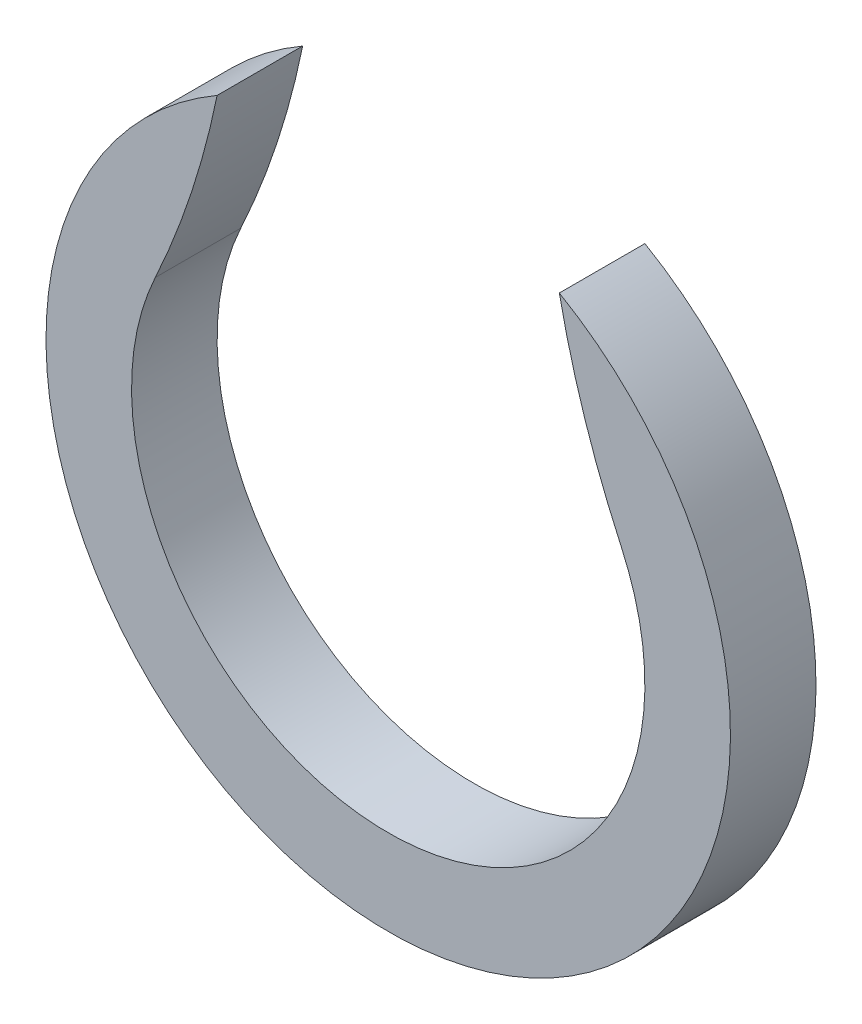
ISO-10303-21;
HEADER;
FILE_DESCRIPTION(('STEP AP214'),'2;1');
FILE_NAME('part.step','',(''),(''),'','','');
FILE_SCHEMA(('AUTOMOTIVE_DESIGN { 1 0 10303 214 1 1 1 1 }'));
ENDSEC;
DATA;
#1=APPLICATION_CONTEXT('core data for automotive mechanical design processes');
#2=APPLICATION_PROTOCOL_DEFINITION('international standard','automotive_design',2000,#1);
#3=PRODUCT_CONTEXT('',#1,'mechanical');
#4=PRODUCT('Part','Part','',(#3));
#5=PRODUCT_RELATED_PRODUCT_CATEGORY('part','',(#4));
#6=PRODUCT_DEFINITION_FORMATION('','',#4);
#7=PRODUCT_DEFINITION_CONTEXT('part definition',#1,'design');
#8=PRODUCT_DEFINITION('design','',#6,#7);
#9=PRODUCT_DEFINITION_SHAPE('','',#8);
#10=(LENGTH_UNIT() NAMED_UNIT(*) SI_UNIT(.MILLI.,.METRE.));
#11=(NAMED_UNIT(*) PLANE_ANGLE_UNIT() SI_UNIT($,.RADIAN.));
#12=(NAMED_UNIT(*) SI_UNIT($,.STERADIAN.) SOLID_ANGLE_UNIT());
#13=UNCERTAINTY_MEASURE_WITH_UNIT(LENGTH_MEASURE(1.E-05),#10,'distance_accuracy_value','');
#14=(GEOMETRIC_REPRESENTATION_CONTEXT(3) GLOBAL_UNCERTAINTY_ASSIGNED_CONTEXT((#13)) GLOBAL_UNIT_ASSIGNED_CONTEXT((#10,
#11,#12)) REPRESENTATION_CONTEXT('',''));
#15=CARTESIAN_POINT('',(0.,0.,0.));
#16=DIRECTION('',(0.,0.,1.));
#17=DIRECTION('',(1.,0.,0.));
#18=AXIS2_PLACEMENT_3D('',#15,#16,#17);
#19=CARTESIAN_POINT('',(0.,0.,1.));
#20=DIRECTION('',(0.,0.,-1.));
#21=DIRECTION('',(-1.,0.,0.));
#22=AXIS2_PLACEMENT_3D('',#19,#20,#21);
#23=CYLINDRICAL_SURFACE('',#22,3.);
#24=CARTESIAN_POINT('',(0.,0.,1.));
#25=DIRECTION('',(0.,0.,-1.));
#26=DIRECTION('',(1.,0.,0.));
#27=AXIS2_PLACEMENT_3D('',#24,#25,#26);
#28=CIRCLE('',#27,3.);
#29=CARTESIAN_POINT('',(2.72297687526977,1.25912546505346,1.));
#30=VERTEX_POINT('',#29);
#31=CARTESIAN_POINT('',(-2.72297687526977,1.25912546505346,1.));
#32=VERTEX_POINT('',#31);
#33=EDGE_CURVE('E82',#30,#32,#28,.T.);
#34=ORIENTED_EDGE('',*,*,#33,.F.);
#35=DIRECTION('',(0.,0.,-1.));
#36=VECTOR('',#35,1.);
#37=CARTESIAN_POINT('',(2.72297687526977,1.25912546505346,1.));
#38=LINE('',#37,#36);
#39=CARTESIAN_POINT('',(2.72297687526977,1.25912546505346,0.));
#40=VERTEX_POINT('',#39);
#41=EDGE_CURVE('E102',#30,#40,#38,.T.);
#42=ORIENTED_EDGE('',*,*,#41,.T.);
#43=CARTESIAN_POINT('',(0.,0.,0.));
#44=DIRECTION('',(0.,0.,-1.));
#45=DIRECTION('',(1.,0.,0.));
#46=AXIS2_PLACEMENT_3D('',#43,#44,#45);
#47=CIRCLE('',#46,3.);
#48=CARTESIAN_POINT('',(-2.72297687526977,1.25912546505346,0.));
#49=VERTEX_POINT('',#48);
#50=EDGE_CURVE('E117',#40,#49,#47,.T.);
#51=ORIENTED_EDGE('',*,*,#50,.T.);
#52=DIRECTION('',(0.,0.,-1.));
#53=VECTOR('',#52,1.);
#54=CARTESIAN_POINT('',(-2.72297687526977,1.25912546505346,1.));
#55=LINE('',#54,#53);
#56=EDGE_CURVE('E55',#49,#32,#55,.F.);
#57=ORIENTED_EDGE('',*,*,#56,.T.);
#58=EDGE_LOOP('',(#34,#42,#51,#57));
#59=FACE_BOUND('',#58,.T.);
#60=ADVANCED_FACE('F39',(#59),#23,.F.);
#61=CARTESIAN_POINT('',(0.,0.,1.));
#62=DIRECTION('',(0.,0.,-1.));
#63=DIRECTION('',(-1.,0.,0.));
#64=AXIS2_PLACEMENT_3D('',#61,#62,#63);
#65=CYLINDRICAL_SURFACE('',#64,4.);
#66=CARTESIAN_POINT('',(0.,0.,0.));
#67=DIRECTION('',(0.,0.,1.));
#68=DIRECTION('',(1.,0.,0.));
#69=AXIS2_PLACEMENT_3D('',#66,#67,#68);
#70=CIRCLE('',#69,4.);
#71=CARTESIAN_POINT('',(-2.,3.46410161513775,0.));
#72=VERTEX_POINT('',#71);
#73=CARTESIAN_POINT('',(2.,3.46410161513775,0.));
#74=VERTEX_POINT('',#73);
#75=EDGE_CURVE('E116',#72,#74,#70,.T.);
#76=ORIENTED_EDGE('',*,*,#75,.T.);
#77=DIRECTION('',(0.,0.,-1.));
#78=VECTOR('',#77,1.);
#79=CARTESIAN_POINT('',(2.,3.46410161513775,1.));
#80=LINE('',#79,#78);
#81=CARTESIAN_POINT('',(2.,3.46410161513775,1.));
#82=VERTEX_POINT('',#81);
#83=EDGE_CURVE('E94',#82,#74,#80,.T.);
#84=ORIENTED_EDGE('',*,*,#83,.F.);
#85=CARTESIAN_POINT('',(0.,0.,1.));
#86=DIRECTION('',(0.,0.,1.));
#87=DIRECTION('',(1.,0.,0.));
#88=AXIS2_PLACEMENT_3D('',#85,#86,#87);
#89=CIRCLE('',#88,4.);
#90=CARTESIAN_POINT('',(-2.,3.46410161513775,1.));
#91=VERTEX_POINT('',#90);
#92=EDGE_CURVE('E80',#91,#82,#89,.T.);
#93=ORIENTED_EDGE('',*,*,#92,.F.);
#94=DIRECTION('',(0.,0.,-1.));
#95=VECTOR('',#94,1.);
#96=CARTESIAN_POINT('',(-2.,3.46410161513775,1.));
#97=LINE('',#96,#95);
#98=EDGE_CURVE('E91',#91,#72,#97,.T.);
#99=ORIENTED_EDGE('',*,*,#98,.T.);
#100=EDGE_LOOP('',(#76,#84,#93,#99));
#101=FACE_BOUND('',#100,.T.);
#102=ADVANCED_FACE('F90',(#101),#65,.T.);
#103=CARTESIAN_POINT('',(0.,0.,1.));
#104=DIRECTION('',(0.,0.,1.));
#105=DIRECTION('',(1.,0.,0.));
#106=AXIS2_PLACEMENT_3D('',#103,#104,#105);
#107=PLANE('',#106);
#108=ORIENTED_EDGE('',*,*,#92,.T.);
#109=CARTESIAN_POINT('',(11.7995664595023,5.456210348565,1.));
#110=DIRECTION('',(0.,0.,1.));
#111=DIRECTION('',(1.,0.,0.));
#112=AXIS2_PLACEMENT_3D('',#109,#110,#111);
#113=CIRCLE('',#112,10.);
#114=EDGE_CURVE('E11',#82,#30,#113,.T.);
#115=ORIENTED_EDGE('',*,*,#114,.T.);
#116=ORIENTED_EDGE('',*,*,#33,.T.);
#117=CARTESIAN_POINT('',(-11.7995664595023,5.45621034856501,1.));
#118=DIRECTION('',(0.,0.,1.));
#119=DIRECTION('',(1.,0.,0.));
#120=AXIS2_PLACEMENT_3D('',#117,#118,#119);
#121=CIRCLE('',#120,10.);
#122=EDGE_CURVE('E48',#32,#91,#121,.T.);
#123=ORIENTED_EDGE('',*,*,#122,.T.);
#124=EDGE_LOOP('',(#108,#115,#116,#123));
#125=FACE_BOUND('',#124,.T.);
#126=ADVANCED_FACE('F79',(#125),#107,.T.);
#127=CARTESIAN_POINT('',(0.,0.,0.));
#128=DIRECTION('',(0.,0.,1.));
#129=DIRECTION('',(1.,0.,0.));
#130=AXIS2_PLACEMENT_3D('',#127,#128,#129);
#131=PLANE('',#130);
#132=ORIENTED_EDGE('',*,*,#50,.F.);
#133=CARTESIAN_POINT('',(11.7995664595023,5.456210348565,0.));
#134=DIRECTION('',(0.,0.,1.));
#135=DIRECTION('',(1.,0.,0.));
#136=AXIS2_PLACEMENT_3D('',#133,#134,#135);
#137=CIRCLE('',#136,10.);
#138=EDGE_CURVE('E86',#40,#74,#137,.F.);
#139=ORIENTED_EDGE('',*,*,#138,.T.);
#140=ORIENTED_EDGE('',*,*,#75,.F.);
#141=CARTESIAN_POINT('',(-11.7995664595023,5.45621034856501,0.));
#142=DIRECTION('',(0.,0.,1.));
#143=DIRECTION('',(1.,0.,0.));
#144=AXIS2_PLACEMENT_3D('',#141,#142,#143);
#145=CIRCLE('',#144,10.);
#146=EDGE_CURVE('E97',#72,#49,#145,.F.);
#147=ORIENTED_EDGE('',*,*,#146,.T.);
#148=EDGE_LOOP('',(#132,#139,#140,#147));
#149=FACE_BOUND('',#148,.T.);
#150=ADVANCED_FACE('F115',(#149),#131,.F.);
#151=CARTESIAN_POINT('',(11.7995664595023,5.456210348565,1.));
#152=DIRECTION('',(0.,0.,-1.));
#153=DIRECTION('',(-1.,0.,0.));
#154=AXIS2_PLACEMENT_3D('',#151,#152,#153);
#155=CYLINDRICAL_SURFACE('',#154,10.);
#156=ORIENTED_EDGE('',*,*,#114,.F.);
#157=ORIENTED_EDGE('',*,*,#83,.T.);
#158=ORIENTED_EDGE('',*,*,#138,.F.);
#159=ORIENTED_EDGE('',*,*,#41,.F.);
#160=EDGE_LOOP('',(#156,#157,#158,#159));
#161=FACE_BOUND('',#160,.T.);
#162=ADVANCED_FACE('F121',(#161),#155,.T.);
#163=CARTESIAN_POINT('',(-11.7995664595023,5.45621034856501,1.));
#164=DIRECTION('',(0.,0.,-1.));
#165=DIRECTION('',(-1.,0.,0.));
#166=AXIS2_PLACEMENT_3D('',#163,#164,#165);
#167=CYLINDRICAL_SURFACE('',#166,10.);
#168=ORIENTED_EDGE('',*,*,#122,.F.);
#169=ORIENTED_EDGE('',*,*,#56,.F.);
#170=ORIENTED_EDGE('',*,*,#146,.F.);
#171=ORIENTED_EDGE('',*,*,#98,.F.);
#172=EDGE_LOOP('',(#168,#169,#170,#171));
#173=FACE_BOUND('',#172,.T.);
#174=ADVANCED_FACE('F41',(#173),#167,.T.);
#175=CLOSED_SHELL('',(#60,#102,#126,#150,#162,#174));
#176=MANIFOLD_SOLID_BREP('B2',#175);
#177=ADVANCED_BREP_SHAPE_REPRESENTATION('',(#18,#176),#14);
#178=SHAPE_DEFINITION_REPRESENTATION(#9,#177);
ENDSEC;
END-ISO-10303-21;
